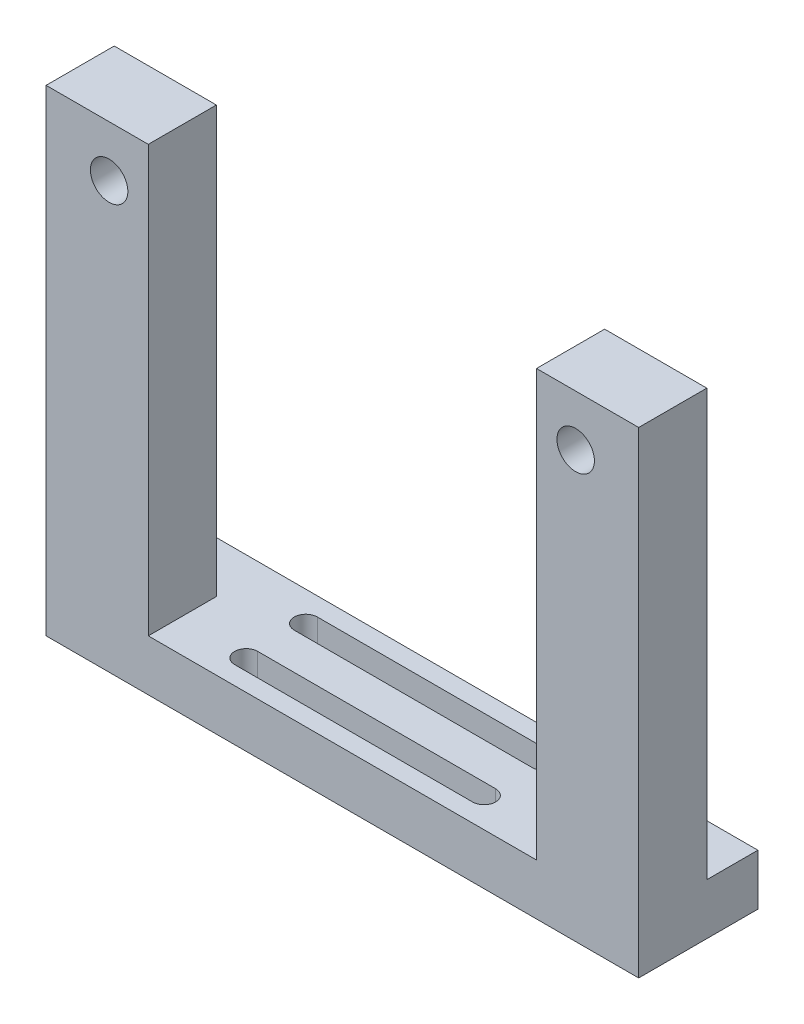
ISO-10303-21;
HEADER;
FILE_DESCRIPTION(('STEP AP214'),'2;1');
FILE_NAME('part.step','',(''),(''),'','','');
FILE_SCHEMA(('AUTOMOTIVE_DESIGN { 1 0 10303 214 1 1 1 1 }'));
ENDSEC;
DATA;
#1=APPLICATION_CONTEXT('core data for automotive mechanical design processes');
#2=APPLICATION_PROTOCOL_DEFINITION('international standard','automotive_design',2000,#1);
#3=PRODUCT_CONTEXT('',#1,'mechanical');
#4=PRODUCT('Part','Part','',(#3));
#5=PRODUCT_RELATED_PRODUCT_CATEGORY('part','',(#4));
#6=PRODUCT_DEFINITION_FORMATION('','',#4);
#7=PRODUCT_DEFINITION_CONTEXT('part definition',#1,'design');
#8=PRODUCT_DEFINITION('design','',#6,#7);
#9=PRODUCT_DEFINITION_SHAPE('','',#8);
#10=(LENGTH_UNIT() NAMED_UNIT(*) SI_UNIT(.MILLI.,.METRE.));
#11=(NAMED_UNIT(*) PLANE_ANGLE_UNIT() SI_UNIT($,.RADIAN.));
#12=(NAMED_UNIT(*) SI_UNIT($,.STERADIAN.) SOLID_ANGLE_UNIT());
#13=UNCERTAINTY_MEASURE_WITH_UNIT(LENGTH_MEASURE(1.E-05),#10,'distance_accuracy_value','');
#14=(GEOMETRIC_REPRESENTATION_CONTEXT(3) GLOBAL_UNCERTAINTY_ASSIGNED_CONTEXT((#13)) GLOBAL_UNIT_ASSIGNED_CONTEXT((#10,
#11,#12)) REPRESENTATION_CONTEXT('',''));
#15=CARTESIAN_POINT('',(0.,0.,0.));
#16=DIRECTION('',(0.,0.,1.));
#17=DIRECTION('',(1.,0.,0.));
#18=AXIS2_PLACEMENT_3D('',#15,#16,#17);
#19=CARTESIAN_POINT('',(0.,0.,0.));
#20=DIRECTION('',(0.,0.,1.));
#21=DIRECTION('',(1.,0.,0.));
#22=AXIS2_PLACEMENT_3D('',#19,#20,#21);
#23=PLANE('',#22);
#24=CARTESIAN_POINT('',(13.7,11.,0.));
#25=DIRECTION('',(0.,0.,-1.));
#26=DIRECTION('',(-1.,0.,0.));
#27=AXIS2_PLACEMENT_3D('',#24,#25,#26);
#28=CIRCLE('',#27,1.1);
#29=CARTESIAN_POINT('',(12.6,11.,0.));
#30=VERTEX_POINT('',#29);
#31=EDGE_CURVE('E255',#30,#30,#28,.T.);
#32=ORIENTED_EDGE('',*,*,#31,.F.);
#33=EDGE_LOOP('',(#32));
#34=FACE_BOUND('',#33,.T.);
#35=DIRECTION('',(0.,-1.,0.));
#36=VECTOR('',#35,1.);
#37=CARTESIAN_POINT('',(17.4,0.,0.));
#38=LINE('',#37,#36);
#39=CARTESIAN_POINT('',(17.4,14.,0.));
#40=VERTEX_POINT('',#39);
#41=CARTESIAN_POINT('',(17.4,-11.,0.));
#42=VERTEX_POINT('',#41);
#43=EDGE_CURVE('E291',#40,#42,#38,.T.);
#44=ORIENTED_EDGE('',*,*,#43,.T.);
#45=DIRECTION('',(-1.,0.,0.));
#46=VECTOR('',#45,1.);
#47=CARTESIAN_POINT('',(-17.4,-11.,0.));
#48=LINE('',#47,#46);
#49=CARTESIAN_POINT('',(11.4,-11.,0.));
#50=VERTEX_POINT('',#49);
#51=EDGE_CURVE('E46',#42,#50,#48,.T.);
#52=ORIENTED_EDGE('',*,*,#51,.T.);
#53=DIRECTION('',(0.,-1.,0.));
#54=VECTOR('',#53,1.);
#55=CARTESIAN_POINT('',(11.4,0.,0.));
#56=LINE('',#55,#54);
#57=CARTESIAN_POINT('',(11.4,14.,0.));
#58=VERTEX_POINT('',#57);
#59=EDGE_CURVE('E297',#58,#50,#56,.T.);
#60=ORIENTED_EDGE('',*,*,#59,.F.);
#61=DIRECTION('',(1.,0.,0.));
#62=VECTOR('',#61,1.);
#63=CARTESIAN_POINT('',(0.,14.,0.));
#64=LINE('',#63,#62);
#65=EDGE_CURVE('E294',#58,#40,#64,.T.);
#66=ORIENTED_EDGE('',*,*,#65,.T.);
#67=EDGE_LOOP('',(#44,#52,#60,#66));
#68=FACE_BOUND('',#67,.T.);
#69=ADVANCED_FACE('F36',(#34,#68),#23,.F.);
#70=CARTESIAN_POINT('',(0.,14.,4.));
#71=DIRECTION('',(0.,1.,0.));
#72=DIRECTION('',(0.,0.,1.));
#73=AXIS2_PLACEMENT_3D('',#70,#71,#72);
#74=PLANE('',#73);
#75=DIRECTION('',(1.,0.,0.));
#76=VECTOR('',#75,1.);
#77=CARTESIAN_POINT('',(0.,14.,0.));
#78=LINE('',#77,#76);
#79=CARTESIAN_POINT('',(-17.4,14.,0.));
#80=VERTEX_POINT('',#79);
#81=CARTESIAN_POINT('',(-11.4,14.,0.));
#82=VERTEX_POINT('',#81);
#83=EDGE_CURVE('E254',#80,#82,#78,.T.);
#84=ORIENTED_EDGE('',*,*,#83,.F.);
#85=DIRECTION('',(0.,0.,-1.));
#86=VECTOR('',#85,1.);
#87=CARTESIAN_POINT('',(-17.4,14.,4.));
#88=LINE('',#87,#86);
#89=CARTESIAN_POINT('',(-17.4,14.,4.));
#90=VERTEX_POINT('',#89);
#91=EDGE_CURVE('E40',#90,#80,#88,.T.);
#92=ORIENTED_EDGE('',*,*,#91,.F.);
#93=DIRECTION('',(1.,0.,0.));
#94=VECTOR('',#93,1.);
#95=CARTESIAN_POINT('',(0.,14.,4.));
#96=LINE('',#95,#94);
#97=CARTESIAN_POINT('',(-11.4,14.,4.));
#98=VERTEX_POINT('',#97);
#99=EDGE_CURVE('E263',#90,#98,#96,.T.);
#100=ORIENTED_EDGE('',*,*,#99,.T.);
#101=DIRECTION('',(0.,0.,-1.));
#102=VECTOR('',#101,1.);
#103=CARTESIAN_POINT('',(-11.4,14.,4.));
#104=LINE('',#103,#102);
#105=EDGE_CURVE('E285',#98,#82,#104,.T.);
#106=ORIENTED_EDGE('',*,*,#105,.T.);
#107=EDGE_LOOP('',(#84,#92,#100,#106));
#108=FACE_BOUND('',#107,.T.);
#109=ADVANCED_FACE('F38',(#108),#74,.T.);
#110=CARTESIAN_POINT('',(-17.4,0.,4.));
#111=DIRECTION('',(1.,0.,0.));
#112=DIRECTION('',(0.,0.,-1.));
#113=AXIS2_PLACEMENT_3D('',#110,#111,#112);
#114=PLANE('',#113);
#115=DIRECTION('',(0.,-1.,0.));
#116=VECTOR('',#115,1.);
#117=CARTESIAN_POINT('',(-17.4,0.,0.));
#118=LINE('',#117,#116);
#119=CARTESIAN_POINT('',(-17.4,-11.,0.));
#120=VERTEX_POINT('',#119);
#121=EDGE_CURVE('E288',#80,#120,#118,.T.);
#122=ORIENTED_EDGE('',*,*,#121,.T.);
#123=DIRECTION('',(0.,0.,-1.));
#124=VECTOR('',#123,1.);
#125=CARTESIAN_POINT('',(-17.4,-11.,0.));
#126=LINE('',#125,#124);
#127=CARTESIAN_POINT('',(-17.4,-11.,-3.));
#128=VERTEX_POINT('',#127);
#129=EDGE_CURVE('E234',#120,#128,#126,.T.);
#130=ORIENTED_EDGE('',*,*,#129,.T.);
#131=DIRECTION('',(0.,-1.,0.));
#132=VECTOR('',#131,1.);
#133=CARTESIAN_POINT('',(-17.4,-11.,-3.));
#134=LINE('',#133,#132);
#135=CARTESIAN_POINT('',(-17.4,-14.,-3.));
#136=VERTEX_POINT('',#135);
#137=EDGE_CURVE('E242',#128,#136,#134,.T.);
#138=ORIENTED_EDGE('',*,*,#137,.T.);
#139=DIRECTION('',(0.,0.,-1.));
#140=VECTOR('',#139,1.);
#141=CARTESIAN_POINT('',(-17.4,-14.,4.));
#142=LINE('',#141,#140);
#143=CARTESIAN_POINT('',(-17.4,-14.,4.));
#144=VERTEX_POINT('',#143);
#145=EDGE_CURVE('E314',#144,#136,#142,.T.);
#146=ORIENTED_EDGE('',*,*,#145,.F.);
#147=DIRECTION('',(0.,-1.,0.));
#148=VECTOR('',#147,1.);
#149=CARTESIAN_POINT('',(-17.4,0.,4.));
#150=LINE('',#149,#148);
#151=EDGE_CURVE('E266',#90,#144,#150,.T.);
#152=ORIENTED_EDGE('',*,*,#151,.F.);
#153=ORIENTED_EDGE('',*,*,#91,.T.);
#154=EDGE_LOOP('',(#122,#130,#138,#146,#152,#153));
#155=FACE_BOUND('',#154,.T.);
#156=ADVANCED_FACE('F321',(#155),#114,.F.);
#157=CARTESIAN_POINT('',(0.,-14.,4.));
#158=DIRECTION('',(0.,1.,0.));
#159=DIRECTION('',(0.,0.,1.));
#160=AXIS2_PLACEMENT_3D('',#157,#158,#159);
#161=PLANE('',#160);
#162=DIRECTION('',(1.,0.,0.));
#163=VECTOR('',#162,1.);
#164=CARTESIAN_POINT('',(6.57148293580189,-14.,-0.575));
#165=LINE('',#164,#163);
#166=CARTESIAN_POINT('',(-7.4,-14.,-0.575));
#167=VERTEX_POINT('',#166);
#168=CARTESIAN_POINT('',(6.57148293580189,-14.,-0.575));
#169=VERTEX_POINT('',#168);
#170=EDGE_CURVE('E175',#167,#169,#165,.T.);
#171=ORIENTED_EDGE('',*,*,#170,.T.);
#172=CARTESIAN_POINT('',(6.57148293580189,-14.,-1.25));
#173=DIRECTION('',(0.,1.,0.));
#174=DIRECTION('',(0.,0.,1.));
#175=AXIS2_PLACEMENT_3D('',#172,#173,#174);
#176=CIRCLE('',#175,0.675);
#177=CARTESIAN_POINT('',(6.57148293580189,-14.,-1.925));
#178=VERTEX_POINT('',#177);
#179=EDGE_CURVE('E167',#169,#178,#176,.T.);
#180=ORIENTED_EDGE('',*,*,#179,.T.);
#181=DIRECTION('',(-1.,0.,0.));
#182=VECTOR('',#181,1.);
#183=CARTESIAN_POINT('',(6.57148293580189,-14.,-1.925));
#184=LINE('',#183,#182);
#185=CARTESIAN_POINT('',(-7.4,-14.,-1.925));
#186=VERTEX_POINT('',#185);
#187=EDGE_CURVE('E178',#178,#186,#184,.T.);
#188=ORIENTED_EDGE('',*,*,#187,.T.);
#189=CARTESIAN_POINT('',(-7.4,-14.,-1.25));
#190=DIRECTION('',(0.,1.,0.));
#191=DIRECTION('',(0.,0.,1.));
#192=AXIS2_PLACEMENT_3D('',#189,#190,#191);
#193=CIRCLE('',#192,0.675);
#194=EDGE_CURVE('E53',#186,#167,#193,.T.);
#195=ORIENTED_EDGE('',*,*,#194,.T.);
#196=EDGE_LOOP('',(#171,#180,#188,#195));
#197=FACE_BOUND('',#196,.T.);
#198=DIRECTION('',(-1.,0.,0.));
#199=VECTOR('',#198,1.);
#200=CARTESIAN_POINT('',(-7.4,-14.,1.575));
#201=LINE('',#200,#199);
#202=CARTESIAN_POINT('',(6.57148293580189,-14.,1.575));
#203=VERTEX_POINT('',#202);
#204=CARTESIAN_POINT('',(-7.4,-14.,1.575));
#205=VERTEX_POINT('',#204);
#206=EDGE_CURVE('E213',#203,#205,#201,.T.);
#207=ORIENTED_EDGE('',*,*,#206,.T.);
#208=CARTESIAN_POINT('',(-7.4,-14.,2.25));
#209=DIRECTION('',(0.,1.,0.));
#210=DIRECTION('',(0.,0.,1.));
#211=AXIS2_PLACEMENT_3D('',#208,#209,#210);
#212=CIRCLE('',#211,0.675);
#213=CARTESIAN_POINT('',(-7.4,-14.,2.925));
#214=VERTEX_POINT('',#213);
#215=EDGE_CURVE('E205',#205,#214,#212,.T.);
#216=ORIENTED_EDGE('',*,*,#215,.T.);
#217=DIRECTION('',(1.,0.,0.));
#218=VECTOR('',#217,1.);
#219=CARTESIAN_POINT('',(-7.4,-14.,2.925));
#220=LINE('',#219,#218);
#221=CARTESIAN_POINT('',(6.57148293580189,-14.,2.925));
#222=VERTEX_POINT('',#221);
#223=EDGE_CURVE('E208',#214,#222,#220,.T.);
#224=ORIENTED_EDGE('',*,*,#223,.T.);
#225=CARTESIAN_POINT('',(6.57148293580189,-14.,2.25));
#226=DIRECTION('',(0.,1.,0.));
#227=DIRECTION('',(0.,0.,1.));
#228=AXIS2_PLACEMENT_3D('',#225,#226,#227);
#229=CIRCLE('',#228,0.675);
#230=EDGE_CURVE('E61',#222,#203,#229,.T.);
#231=ORIENTED_EDGE('',*,*,#230,.T.);
#232=EDGE_LOOP('',(#207,#216,#224,#231));
#233=FACE_BOUND('',#232,.T.);
#234=ORIENTED_EDGE('',*,*,#145,.T.);
#235=DIRECTION('',(1.,0.,0.));
#236=VECTOR('',#235,1.);
#237=CARTESIAN_POINT('',(-17.4,-14.,-3.));
#238=LINE('',#237,#236);
#239=CARTESIAN_POINT('',(17.4,-14.,-3.));
#240=VERTEX_POINT('',#239);
#241=EDGE_CURVE('E201',#136,#240,#238,.T.);
#242=ORIENTED_EDGE('',*,*,#241,.T.);
#243=DIRECTION('',(0.,0.,-1.));
#244=VECTOR('',#243,1.);
#245=CARTESIAN_POINT('',(17.4,-14.,4.));
#246=LINE('',#245,#244);
#247=CARTESIAN_POINT('',(17.4,-14.,4.));
#248=VERTEX_POINT('',#247);
#249=EDGE_CURVE('E313',#248,#240,#246,.T.);
#250=ORIENTED_EDGE('',*,*,#249,.F.);
#251=DIRECTION('',(1.,0.,0.));
#252=VECTOR('',#251,1.);
#253=CARTESIAN_POINT('',(0.,-14.,4.));
#254=LINE('',#253,#252);
#255=EDGE_CURVE('E269',#144,#248,#254,.T.);
#256=ORIENTED_EDGE('',*,*,#255,.F.);
#257=EDGE_LOOP('',(#234,#242,#250,#256));
#258=FACE_BOUND('',#257,.T.);
#259=ADVANCED_FACE('F182',(#197,#233,#258),#161,.F.);
#260=CARTESIAN_POINT('',(17.4,0.,4.));
#261=DIRECTION('',(1.,0.,0.));
#262=DIRECTION('',(0.,0.,-1.));
#263=AXIS2_PLACEMENT_3D('',#260,#261,#262);
#264=PLANE('',#263);
#265=ORIENTED_EDGE('',*,*,#43,.F.);
#266=DIRECTION('',(0.,0.,-1.));
#267=VECTOR('',#266,1.);
#268=CARTESIAN_POINT('',(17.4,14.,4.));
#269=LINE('',#268,#267);
#270=CARTESIAN_POINT('',(17.4,14.,4.));
#271=VERTEX_POINT('',#270);
#272=EDGE_CURVE('E311',#271,#40,#269,.T.);
#273=ORIENTED_EDGE('',*,*,#272,.F.);
#274=DIRECTION('',(0.,-1.,0.));
#275=VECTOR('',#274,1.);
#276=CARTESIAN_POINT('',(17.4,0.,4.));
#277=LINE('',#276,#275);
#278=EDGE_CURVE('E271',#271,#248,#277,.T.);
#279=ORIENTED_EDGE('',*,*,#278,.T.);
#280=ORIENTED_EDGE('',*,*,#249,.T.);
#281=DIRECTION('',(0.,-1.,0.));
#282=VECTOR('',#281,1.);
#283=CARTESIAN_POINT('',(17.4,-11.,-3.));
#284=LINE('',#283,#282);
#285=CARTESIAN_POINT('',(17.4,-11.,-3.));
#286=VERTEX_POINT('',#285);
#287=EDGE_CURVE('E245',#286,#240,#284,.T.);
#288=ORIENTED_EDGE('',*,*,#287,.F.);
#289=DIRECTION('',(0.,0.,1.));
#290=VECTOR('',#289,1.);
#291=CARTESIAN_POINT('',(17.4,-11.,0.));
#292=LINE('',#291,#290);
#293=EDGE_CURVE('E240',#286,#42,#292,.T.);
#294=ORIENTED_EDGE('',*,*,#293,.T.);
#295=EDGE_LOOP('',(#265,#273,#279,#280,#288,#294));
#296=FACE_BOUND('',#295,.T.);
#297=ADVANCED_FACE('F350',(#296),#264,.T.);
#298=CARTESIAN_POINT('',(0.,14.,4.));
#299=DIRECTION('',(0.,1.,0.));
#300=DIRECTION('',(0.,0.,1.));
#301=AXIS2_PLACEMENT_3D('',#298,#299,#300);
#302=PLANE('',#301);
#303=ORIENTED_EDGE('',*,*,#65,.F.);
#304=DIRECTION('',(0.,0.,-1.));
#305=VECTOR('',#304,1.);
#306=CARTESIAN_POINT('',(11.4,14.,4.));
#307=LINE('',#306,#305);
#308=CARTESIAN_POINT('',(11.4,14.,4.));
#309=VERTEX_POINT('',#308);
#310=EDGE_CURVE('E309',#309,#58,#307,.T.);
#311=ORIENTED_EDGE('',*,*,#310,.F.);
#312=DIRECTION('',(1.,0.,0.));
#313=VECTOR('',#312,1.);
#314=CARTESIAN_POINT('',(0.,14.,4.));
#315=LINE('',#314,#313);
#316=EDGE_CURVE('E274',#309,#271,#315,.T.);
#317=ORIENTED_EDGE('',*,*,#316,.T.);
#318=ORIENTED_EDGE('',*,*,#272,.T.);
#319=EDGE_LOOP('',(#303,#311,#317,#318));
#320=FACE_BOUND('',#319,.T.);
#321=ADVANCED_FACE('F356',(#320),#302,.T.);
#322=CARTESIAN_POINT('',(11.4,0.,4.));
#323=DIRECTION('',(1.,0.,0.));
#324=DIRECTION('',(0.,1.,0.));
#325=AXIS2_PLACEMENT_3D('',#322,#323,#324);
#326=PLANE('',#325);
#327=ORIENTED_EDGE('',*,*,#59,.T.);
#328=DIRECTION('',(0.,0.,-1.));
#329=VECTOR('',#328,1.);
#330=CARTESIAN_POINT('',(11.4,-11.,4.));
#331=LINE('',#330,#329);
#332=CARTESIAN_POINT('',(11.4,-11.,4.));
#333=VERTEX_POINT('',#332);
#334=EDGE_CURVE('E306',#333,#50,#331,.T.);
#335=ORIENTED_EDGE('',*,*,#334,.F.);
#336=DIRECTION('',(0.,-1.,0.));
#337=VECTOR('',#336,1.);
#338=CARTESIAN_POINT('',(11.4,0.,4.));
#339=LINE('',#338,#337);
#340=EDGE_CURVE('E277',#309,#333,#339,.T.);
#341=ORIENTED_EDGE('',*,*,#340,.F.);
#342=ORIENTED_EDGE('',*,*,#310,.T.);
#343=EDGE_LOOP('',(#327,#335,#341,#342));
#344=FACE_BOUND('',#343,.T.);
#345=ADVANCED_FACE('F341',(#344),#326,.F.);
#346=CARTESIAN_POINT('',(0.,-11.,4.));
#347=DIRECTION('',(0.,1.,0.));
#348=DIRECTION('',(0.,0.,1.));
#349=AXIS2_PLACEMENT_3D('',#346,#347,#348);
#350=PLANE('',#349);
#351=CARTESIAN_POINT('',(6.57148293580189,-11.,-1.25));
#352=DIRECTION('',(0.,1.,0.));
#353=DIRECTION('',(0.,0.,1.));
#354=AXIS2_PLACEMENT_3D('',#351,#352,#353);
#355=CIRCLE('',#354,0.675);
#356=CARTESIAN_POINT('',(6.57148293580189,-11.,-0.575));
#357=VERTEX_POINT('',#356);
#358=CARTESIAN_POINT('',(6.57148293580189,-11.,-1.925));
#359=VERTEX_POINT('',#358);
#360=EDGE_CURVE('E170',#357,#359,#355,.T.);
#361=ORIENTED_EDGE('',*,*,#360,.F.);
#362=DIRECTION('',(1.,0.,0.));
#363=VECTOR('',#362,1.);
#364=CARTESIAN_POINT('',(6.57148293580189,-11.,-0.575));
#365=LINE('',#364,#363);
#366=CARTESIAN_POINT('',(-7.4,-11.,-0.575));
#367=VERTEX_POINT('',#366);
#368=EDGE_CURVE('E185',#367,#357,#365,.T.);
#369=ORIENTED_EDGE('',*,*,#368,.F.);
#370=CARTESIAN_POINT('',(-7.4,-11.,-1.25));
#371=DIRECTION('',(0.,1.,0.));
#372=DIRECTION('',(0.,0.,1.));
#373=AXIS2_PLACEMENT_3D('',#370,#371,#372);
#374=CIRCLE('',#373,0.675);
#375=CARTESIAN_POINT('',(-7.4,-11.,-1.925));
#376=VERTEX_POINT('',#375);
#377=EDGE_CURVE('E188',#376,#367,#374,.T.);
#378=ORIENTED_EDGE('',*,*,#377,.F.);
#379=DIRECTION('',(-1.,0.,0.));
#380=VECTOR('',#379,1.);
#381=CARTESIAN_POINT('',(6.57148293580189,-11.,-1.925));
#382=LINE('',#381,#380);
#383=EDGE_CURVE('E194',#359,#376,#382,.T.);
#384=ORIENTED_EDGE('',*,*,#383,.F.);
#385=EDGE_LOOP('',(#361,#369,#378,#384));
#386=FACE_BOUND('',#385,.T.);
#387=CARTESIAN_POINT('',(-7.4,-11.,2.25));
#388=DIRECTION('',(0.,1.,0.));
#389=DIRECTION('',(0.,0.,1.));
#390=AXIS2_PLACEMENT_3D('',#387,#388,#389);
#391=CIRCLE('',#390,0.675);
#392=CARTESIAN_POINT('',(-7.4,-11.,1.575));
#393=VERTEX_POINT('',#392);
#394=CARTESIAN_POINT('',(-7.4,-11.,2.925));
#395=VERTEX_POINT('',#394);
#396=EDGE_CURVE('E217',#393,#395,#391,.T.);
#397=ORIENTED_EDGE('',*,*,#396,.F.);
#398=DIRECTION('',(-1.,0.,0.));
#399=VECTOR('',#398,1.);
#400=CARTESIAN_POINT('',(-7.4,-11.,1.575));
#401=LINE('',#400,#399);
#402=CARTESIAN_POINT('',(6.57148293580189,-11.,1.575));
#403=VERTEX_POINT('',#402);
#404=EDGE_CURVE('E209',#403,#393,#401,.T.);
#405=ORIENTED_EDGE('',*,*,#404,.F.);
#406=CARTESIAN_POINT('',(6.57148293580189,-11.,2.25));
#407=DIRECTION('',(0.,1.,0.));
#408=DIRECTION('',(0.,0.,1.));
#409=AXIS2_PLACEMENT_3D('',#406,#407,#408);
#410=CIRCLE('',#409,0.675);
#411=CARTESIAN_POINT('',(6.57148293580189,-11.,2.925));
#412=VERTEX_POINT('',#411);
#413=EDGE_CURVE('E222',#412,#403,#410,.T.);
#414=ORIENTED_EDGE('',*,*,#413,.F.);
#415=DIRECTION('',(1.,0.,0.));
#416=VECTOR('',#415,1.);
#417=CARTESIAN_POINT('',(-7.4,-11.,2.925));
#418=LINE('',#417,#416);
#419=EDGE_CURVE('E219',#395,#412,#418,.T.);
#420=ORIENTED_EDGE('',*,*,#419,.F.);
#421=EDGE_LOOP('',(#397,#405,#414,#420));
#422=FACE_BOUND('',#421,.T.);
#423=ORIENTED_EDGE('',*,*,#334,.T.);
#424=ORIENTED_EDGE('',*,*,#51,.F.);
#425=ORIENTED_EDGE('',*,*,#293,.F.);
#426=DIRECTION('',(1.,0.,0.));
#427=VECTOR('',#426,1.);
#428=CARTESIAN_POINT('',(-17.4,-11.,-3.));
#429=LINE('',#428,#427);
#430=EDGE_CURVE('E237',#128,#286,#429,.T.);
#431=ORIENTED_EDGE('',*,*,#430,.F.);
#432=ORIENTED_EDGE('',*,*,#129,.F.);
#433=CARTESIAN_POINT('',(-11.4,-11.,0.));
#434=VERTEX_POINT('',#433);
#435=EDGE_CURVE('E11',#434,#120,#48,.T.);
#436=ORIENTED_EDGE('',*,*,#435,.F.);
#437=DIRECTION('',(0.,0.,-1.));
#438=VECTOR('',#437,1.);
#439=CARTESIAN_POINT('',(-11.4,-11.,4.));
#440=LINE('',#439,#438);
#441=CARTESIAN_POINT('',(-11.4,-11.,4.));
#442=VERTEX_POINT('',#441);
#443=EDGE_CURVE('E303',#442,#434,#440,.T.);
#444=ORIENTED_EDGE('',*,*,#443,.F.);
#445=DIRECTION('',(1.,0.,0.));
#446=VECTOR('',#445,1.);
#447=CARTESIAN_POINT('',(0.,-11.,4.));
#448=LINE('',#447,#446);
#449=EDGE_CURVE('E279',#442,#333,#448,.T.);
#450=ORIENTED_EDGE('',*,*,#449,.T.);
#451=EDGE_LOOP('',(#423,#424,#425,#431,#432,#436,#444,#450));
#452=FACE_BOUND('',#451,.T.);
#453=ADVANCED_FACE('F333',(#386,#422,#452),#350,.T.);
#454=CARTESIAN_POINT('',(-11.4,0.,4.));
#455=DIRECTION('',(1.,0.,0.));
#456=DIRECTION('',(0.,1.,0.));
#457=AXIS2_PLACEMENT_3D('',#454,#455,#456);
#458=PLANE('',#457);
#459=DIRECTION('',(0.,-1.,0.));
#460=VECTOR('',#459,1.);
#461=CARTESIAN_POINT('',(-11.4,0.,0.));
#462=LINE('',#461,#460);
#463=EDGE_CURVE('E267',#82,#434,#462,.T.);
#464=ORIENTED_EDGE('',*,*,#463,.F.);
#465=ORIENTED_EDGE('',*,*,#105,.F.);
#466=DIRECTION('',(0.,-1.,0.));
#467=VECTOR('',#466,1.);
#468=CARTESIAN_POINT('',(-11.4,0.,4.));
#469=LINE('',#468,#467);
#470=EDGE_CURVE('E282',#98,#442,#469,.T.);
#471=ORIENTED_EDGE('',*,*,#470,.T.);
#472=ORIENTED_EDGE('',*,*,#443,.T.);
#473=EDGE_LOOP('',(#464,#465,#471,#472));
#474=FACE_BOUND('',#473,.T.);
#475=ADVANCED_FACE('F330',(#474),#458,.T.);
#476=CARTESIAN_POINT('',(0.,0.,4.));
#477=DIRECTION('',(0.,0.,1.));
#478=DIRECTION('',(1.,0.,0.));
#479=AXIS2_PLACEMENT_3D('',#476,#477,#478);
#480=PLANE('',#479);
#481=CARTESIAN_POINT('',(13.7,11.,4.));
#482=DIRECTION('',(0.,0.,-1.));
#483=DIRECTION('',(-1.,0.,0.));
#484=AXIS2_PLACEMENT_3D('',#481,#482,#483);
#485=CIRCLE('',#484,1.1);
#486=CARTESIAN_POINT('',(12.6,11.,4.));
#487=VERTEX_POINT('',#486);
#488=EDGE_CURVE('E251',#487,#487,#485,.T.);
#489=ORIENTED_EDGE('',*,*,#488,.T.);
#490=EDGE_LOOP('',(#489));
#491=FACE_BOUND('',#490,.T.);
#492=CARTESIAN_POINT('',(-13.7,11.,4.));
#493=DIRECTION('',(0.,0.,-1.));
#494=DIRECTION('',(-1.,0.,0.));
#495=AXIS2_PLACEMENT_3D('',#492,#493,#494);
#496=CIRCLE('',#495,1.1);
#497=CARTESIAN_POINT('',(-14.8,11.,4.));
#498=VERTEX_POINT('',#497);
#499=EDGE_CURVE('E258',#498,#498,#496,.T.);
#500=ORIENTED_EDGE('',*,*,#499,.T.);
#501=EDGE_LOOP('',(#500));
#502=FACE_BOUND('',#501,.T.);
#503=ORIENTED_EDGE('',*,*,#99,.F.);
#504=ORIENTED_EDGE('',*,*,#151,.T.);
#505=ORIENTED_EDGE('',*,*,#255,.T.);
#506=ORIENTED_EDGE('',*,*,#278,.F.);
#507=ORIENTED_EDGE('',*,*,#316,.F.);
#508=ORIENTED_EDGE('',*,*,#340,.T.);
#509=ORIENTED_EDGE('',*,*,#449,.F.);
#510=ORIENTED_EDGE('',*,*,#470,.F.);
#511=EDGE_LOOP('',(#503,#504,#505,#506,#507,#508,#509,#510));
#512=FACE_BOUND('',#511,.T.);
#513=ADVANCED_FACE('F335',(#491,#502,#512),#480,.T.);
#514=CARTESIAN_POINT('',(-13.7,11.,0.));
#515=DIRECTION('',(0.,0.,-1.));
#516=DIRECTION('',(-1.,0.,0.));
#517=AXIS2_PLACEMENT_3D('',#514,#515,#516);
#518=CIRCLE('',#517,1.1);
#519=CARTESIAN_POINT('',(-14.8,11.,0.));
#520=VERTEX_POINT('',#519);
#521=EDGE_CURVE('E248',#520,#520,#518,.T.);
#522=ORIENTED_EDGE('',*,*,#521,.F.);
#523=EDGE_LOOP('',(#522));
#524=FACE_BOUND('',#523,.T.);
#525=ORIENTED_EDGE('',*,*,#463,.T.);
#526=ORIENTED_EDGE('',*,*,#435,.T.);
#527=ORIENTED_EDGE('',*,*,#121,.F.);
#528=ORIENTED_EDGE('',*,*,#83,.T.);
#529=EDGE_LOOP('',(#525,#526,#527,#528));
#530=FACE_BOUND('',#529,.T.);
#531=ADVANCED_FACE('F326',(#524,#530),#23,.F.);
#532=CARTESIAN_POINT('',(-13.7,11.,4.));
#533=DIRECTION('',(0.,0.,-1.));
#534=DIRECTION('',(-1.,0.,0.));
#535=AXIS2_PLACEMENT_3D('',#532,#533,#534);
#536=CYLINDRICAL_SURFACE('',#535,1.1);
#537=ORIENTED_EDGE('',*,*,#499,.F.);
#538=EDGE_LOOP('',(#537));
#539=FACE_BOUND('',#538,.T.);
#540=ORIENTED_EDGE('',*,*,#521,.T.);
#541=EDGE_LOOP('',(#540));
#542=FACE_BOUND('',#541,.T.);
#543=ADVANCED_FACE('F375',(#539,#542),#536,.F.);
#544=CARTESIAN_POINT('',(13.7,11.,4.));
#545=DIRECTION('',(0.,0.,-1.));
#546=DIRECTION('',(-1.,0.,0.));
#547=AXIS2_PLACEMENT_3D('',#544,#545,#546);
#548=CYLINDRICAL_SURFACE('',#547,1.1);
#549=ORIENTED_EDGE('',*,*,#488,.F.);
#550=EDGE_LOOP('',(#549));
#551=FACE_BOUND('',#550,.T.);
#552=ORIENTED_EDGE('',*,*,#31,.T.);
#553=EDGE_LOOP('',(#552));
#554=FACE_BOUND('',#553,.T.);
#555=ADVANCED_FACE('F381',(#551,#554),#548,.F.);
#556=CARTESIAN_POINT('',(-17.4,-11.,-3.));
#557=DIRECTION('',(0.,0.,-1.));
#558=DIRECTION('',(-1.,0.,0.));
#559=AXIS2_PLACEMENT_3D('',#556,#557,#558);
#560=PLANE('',#559);
#561=ORIENTED_EDGE('',*,*,#241,.F.);
#562=ORIENTED_EDGE('',*,*,#137,.F.);
#563=ORIENTED_EDGE('',*,*,#430,.T.);
#564=ORIENTED_EDGE('',*,*,#287,.T.);
#565=EDGE_LOOP('',(#561,#562,#563,#564));
#566=FACE_BOUND('',#565,.T.);
#567=ADVANCED_FACE('F354',(#566),#560,.T.);
#568=CARTESIAN_POINT('',(-7.4,-14.,2.25));
#569=DIRECTION('',(0.,1.,0.));
#570=DIRECTION('',(0.,0.,1.));
#571=AXIS2_PLACEMENT_3D('',#568,#569,#570);
#572=CYLINDRICAL_SURFACE('',#571,0.675);
#573=ORIENTED_EDGE('',*,*,#396,.T.);
#574=DIRECTION('',(0.,1.,0.));
#575=VECTOR('',#574,1.);
#576=CARTESIAN_POINT('',(-7.4,-14.,2.925));
#577=LINE('',#576,#575);
#578=EDGE_CURVE('E216',#214,#395,#577,.T.);
#579=ORIENTED_EDGE('',*,*,#578,.F.);
#580=ORIENTED_EDGE('',*,*,#215,.F.);
#581=DIRECTION('',(0.,1.,0.));
#582=VECTOR('',#581,1.);
#583=CARTESIAN_POINT('',(-7.4,-14.,1.575));
#584=LINE('',#583,#582);
#585=EDGE_CURVE('E195',#205,#393,#584,.T.);
#586=ORIENTED_EDGE('',*,*,#585,.T.);
#587=EDGE_LOOP('',(#573,#579,#580,#586));
#588=FACE_BOUND('',#587,.T.);
#589=ADVANCED_FACE('F397',(#588),#572,.F.);
#590=CARTESIAN_POINT('',(-7.4,-14.,1.575));
#591=DIRECTION('',(0.,0.,-1.));
#592=DIRECTION('',(-1.,0.,0.));
#593=AXIS2_PLACEMENT_3D('',#590,#591,#592);
#594=PLANE('',#593);
#595=ORIENTED_EDGE('',*,*,#404,.T.);
#596=ORIENTED_EDGE('',*,*,#585,.F.);
#597=ORIENTED_EDGE('',*,*,#206,.F.);
#598=DIRECTION('',(0.,1.,0.));
#599=VECTOR('',#598,1.);
#600=CARTESIAN_POINT('',(6.57148293580189,-14.,1.575));
#601=LINE('',#600,#599);
#602=EDGE_CURVE('E228',#203,#403,#601,.T.);
#603=ORIENTED_EDGE('',*,*,#602,.T.);
#604=EDGE_LOOP('',(#595,#596,#597,#603));
#605=FACE_BOUND('',#604,.T.);
#606=ADVANCED_FACE('F400',(#605),#594,.F.);
#607=CARTESIAN_POINT('',(6.57148293580189,-14.,2.25));
#608=DIRECTION('',(0.,1.,0.));
#609=DIRECTION('',(0.,0.,1.));
#610=AXIS2_PLACEMENT_3D('',#607,#608,#609);
#611=CYLINDRICAL_SURFACE('',#610,0.675);
#612=ORIENTED_EDGE('',*,*,#413,.T.);
#613=ORIENTED_EDGE('',*,*,#602,.F.);
#614=ORIENTED_EDGE('',*,*,#230,.F.);
#615=DIRECTION('',(0.,1.,0.));
#616=VECTOR('',#615,1.);
#617=CARTESIAN_POINT('',(6.57148293580189,-14.,2.925));
#618=LINE('',#617,#616);
#619=EDGE_CURVE('E230',#222,#412,#618,.T.);
#620=ORIENTED_EDGE('',*,*,#619,.T.);
#621=EDGE_LOOP('',(#612,#613,#614,#620));
#622=FACE_BOUND('',#621,.T.);
#623=ADVANCED_FACE('F405',(#622),#611,.F.);
#624=CARTESIAN_POINT('',(-7.4,-14.,2.925));
#625=DIRECTION('',(0.,0.,1.));
#626=DIRECTION('',(1.,0.,0.));
#627=AXIS2_PLACEMENT_3D('',#624,#625,#626);
#628=PLANE('',#627);
#629=ORIENTED_EDGE('',*,*,#419,.T.);
#630=ORIENTED_EDGE('',*,*,#619,.F.);
#631=ORIENTED_EDGE('',*,*,#223,.F.);
#632=ORIENTED_EDGE('',*,*,#578,.T.);
#633=EDGE_LOOP('',(#629,#630,#631,#632));
#634=FACE_BOUND('',#633,.T.);
#635=ADVANCED_FACE('F402',(#634),#628,.F.);
#636=CARTESIAN_POINT('',(6.57148293580189,-14.,-1.25));
#637=DIRECTION('',(0.,1.,0.));
#638=DIRECTION('',(0.,0.,1.));
#639=AXIS2_PLACEMENT_3D('',#636,#637,#638);
#640=CYLINDRICAL_SURFACE('',#639,0.675);
#641=ORIENTED_EDGE('',*,*,#360,.T.);
#642=DIRECTION('',(0.,1.,0.));
#643=VECTOR('',#642,1.);
#644=CARTESIAN_POINT('',(6.57148293580189,-14.,-1.925));
#645=LINE('',#644,#643);
#646=EDGE_CURVE('E163',#178,#359,#645,.T.);
#647=ORIENTED_EDGE('',*,*,#646,.F.);
#648=ORIENTED_EDGE('',*,*,#179,.F.);
#649=DIRECTION('',(0.,1.,0.));
#650=VECTOR('',#649,1.);
#651=CARTESIAN_POINT('',(6.57148293580189,-14.,-0.575));
#652=LINE('',#651,#650);
#653=EDGE_CURVE('E199',#169,#357,#652,.T.);
#654=ORIENTED_EDGE('',*,*,#653,.T.);
#655=EDGE_LOOP('',(#641,#647,#648,#654));
#656=FACE_BOUND('',#655,.T.);
#657=ADVANCED_FACE('F165',(#656),#640,.F.);
#658=CARTESIAN_POINT('',(6.57148293580189,-14.,-0.575));
#659=DIRECTION('',(0.,0.,1.));
#660=DIRECTION('',(1.,0.,0.));
#661=AXIS2_PLACEMENT_3D('',#658,#659,#660);
#662=PLANE('',#661);
#663=ORIENTED_EDGE('',*,*,#368,.T.);
#664=ORIENTED_EDGE('',*,*,#653,.F.);
#665=ORIENTED_EDGE('',*,*,#170,.F.);
#666=DIRECTION('',(0.,1.,0.));
#667=VECTOR('',#666,1.);
#668=CARTESIAN_POINT('',(-7.4,-14.,-0.575));
#669=LINE('',#668,#667);
#670=EDGE_CURVE('E202',#167,#367,#669,.T.);
#671=ORIENTED_EDGE('',*,*,#670,.T.);
#672=EDGE_LOOP('',(#663,#664,#665,#671));
#673=FACE_BOUND('',#672,.T.);
#674=ADVANCED_FACE('F414',(#673),#662,.F.);
#675=CARTESIAN_POINT('',(-7.4,-14.,-1.25));
#676=DIRECTION('',(0.,1.,0.));
#677=DIRECTION('',(0.,0.,1.));
#678=AXIS2_PLACEMENT_3D('',#675,#676,#677);
#679=CYLINDRICAL_SURFACE('',#678,0.675);
#680=ORIENTED_EDGE('',*,*,#377,.T.);
#681=ORIENTED_EDGE('',*,*,#670,.F.);
#682=ORIENTED_EDGE('',*,*,#194,.F.);
#683=DIRECTION('',(0.,1.,0.));
#684=VECTOR('',#683,1.);
#685=CARTESIAN_POINT('',(-7.4,-14.,-1.925));
#686=LINE('',#685,#684);
#687=EDGE_CURVE('E174',#186,#376,#686,.T.);
#688=ORIENTED_EDGE('',*,*,#687,.T.);
#689=EDGE_LOOP('',(#680,#681,#682,#688));
#690=FACE_BOUND('',#689,.T.);
#691=ADVANCED_FACE('F417',(#690),#679,.F.);
#692=CARTESIAN_POINT('',(6.57148293580189,-14.,-1.925));
#693=DIRECTION('',(0.,0.,-1.));
#694=DIRECTION('',(-1.,0.,0.));
#695=AXIS2_PLACEMENT_3D('',#692,#693,#694);
#696=PLANE('',#695);
#697=ORIENTED_EDGE('',*,*,#383,.T.);
#698=ORIENTED_EDGE('',*,*,#687,.F.);
#699=ORIENTED_EDGE('',*,*,#187,.F.);
#700=ORIENTED_EDGE('',*,*,#646,.T.);
#701=EDGE_LOOP('',(#697,#698,#699,#700));
#702=FACE_BOUND('',#701,.T.);
#703=ADVANCED_FACE('F179',(#702),#696,.F.);
#704=CLOSED_SHELL('',(#69,#109,#156,#259,#297,#321,#345,#453,#475,#513,#531,#543,#555,#567,#589,
#606,#623,#635,#657,#674,#691,#703));
#705=MANIFOLD_SOLID_BREP('B2',#704);
#706=ADVANCED_BREP_SHAPE_REPRESENTATION('',(#18,#705),#14);
#707=SHAPE_DEFINITION_REPRESENTATION(#9,#706);
ENDSEC;
END-ISO-10303-21;
